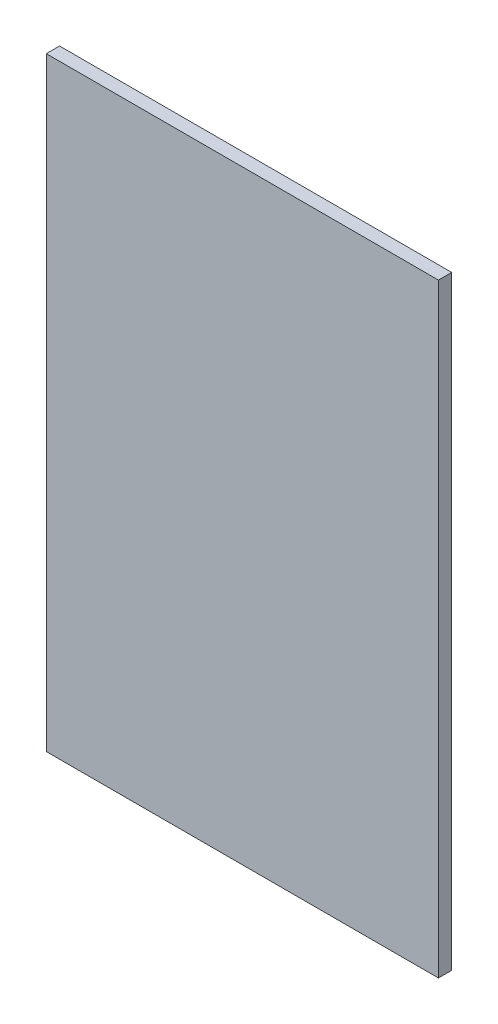
ISO-10303-21;
HEADER;
FILE_DESCRIPTION(('STEP AP214'),'2;1');
FILE_NAME('part.step','',(''),(''),'','','');
FILE_SCHEMA(('AUTOMOTIVE_DESIGN { 1 0 10303 214 1 1 1 1 }'));
ENDSEC;
DATA;
#1=APPLICATION_CONTEXT('core data for automotive mechanical design processes');
#2=APPLICATION_PROTOCOL_DEFINITION('international standard','automotive_design',2000,#1);
#3=PRODUCT_CONTEXT('',#1,'mechanical');
#4=PRODUCT('Part','Part','',(#3));
#5=PRODUCT_RELATED_PRODUCT_CATEGORY('part','',(#4));
#6=PRODUCT_DEFINITION_FORMATION('','',#4);
#7=PRODUCT_DEFINITION_CONTEXT('part definition',#1,'design');
#8=PRODUCT_DEFINITION('design','',#6,#7);
#9=PRODUCT_DEFINITION_SHAPE('','',#8);
#10=(LENGTH_UNIT() NAMED_UNIT(*) SI_UNIT(.MILLI.,.METRE.));
#11=(NAMED_UNIT(*) PLANE_ANGLE_UNIT() SI_UNIT($,.RADIAN.));
#12=(NAMED_UNIT(*) SI_UNIT($,.STERADIAN.) SOLID_ANGLE_UNIT());
#13=UNCERTAINTY_MEASURE_WITH_UNIT(LENGTH_MEASURE(1.E-05),#10,'distance_accuracy_value','');
#14=(GEOMETRIC_REPRESENTATION_CONTEXT(3) GLOBAL_UNCERTAINTY_ASSIGNED_CONTEXT((#13)) GLOBAL_UNIT_ASSIGNED_CONTEXT((#10,
#11,#12)) REPRESENTATION_CONTEXT('',''));
#15=CARTESIAN_POINT('',(0.,0.,0.));
#16=DIRECTION('',(0.,0.,1.));
#17=DIRECTION('',(1.,0.,0.));
#18=AXIS2_PLACEMENT_3D('',#15,#16,#17);
#19=CARTESIAN_POINT('',(266.,410.,18.));
#20=DIRECTION('',(-1.,0.,0.));
#21=DIRECTION('',(0.,-1.,0.));
#22=AXIS2_PLACEMENT_3D('',#19,#20,#21);
#23=PLANE('',#22);
#24=DIRECTION('',(0.,1.,0.));
#25=VECTOR('',#24,1.);
#26=CARTESIAN_POINT('',(266.,410.,0.));
#27=LINE('',#26,#25);
#28=CARTESIAN_POINT('',(266.,-410.,0.));
#29=VERTEX_POINT('',#28);
#30=CARTESIAN_POINT('',(266.,410.,0.));
#31=VERTEX_POINT('',#30);
#32=EDGE_CURVE('E107',#29,#31,#27,.T.);
#33=ORIENTED_EDGE('',*,*,#32,.T.);
#34=DIRECTION('',(0.,0.,-1.));
#35=VECTOR('',#34,1.);
#36=CARTESIAN_POINT('',(266.,410.,18.));
#37=LINE('',#36,#35);
#38=CARTESIAN_POINT('',(266.,410.,18.));
#39=VERTEX_POINT('',#38);
#40=EDGE_CURVE('E11',#39,#31,#37,.T.);
#41=ORIENTED_EDGE('',*,*,#40,.F.);
#42=DIRECTION('',(0.,1.,0.));
#43=VECTOR('',#42,1.);
#44=CARTESIAN_POINT('',(266.,410.,18.));
#45=LINE('',#44,#43);
#46=CARTESIAN_POINT('',(266.,-410.,18.));
#47=VERTEX_POINT('',#46);
#48=EDGE_CURVE('E91',#47,#39,#45,.T.);
#49=ORIENTED_EDGE('',*,*,#48,.F.);
#50=DIRECTION('',(0.,0.,-1.));
#51=VECTOR('',#50,1.);
#52=CARTESIAN_POINT('',(266.,-410.,18.));
#53=LINE('',#52,#51);
#54=EDGE_CURVE('E103',#47,#29,#53,.T.);
#55=ORIENTED_EDGE('',*,*,#54,.T.);
#56=EDGE_LOOP('',(#33,#41,#49,#55));
#57=FACE_BOUND('',#56,.T.);
#58=ADVANCED_FACE('F39',(#57),#23,.F.);
#59=CARTESIAN_POINT('',(-266.,410.,18.));
#60=DIRECTION('',(0.,-1.,0.));
#61=DIRECTION('',(0.,0.,-1.));
#62=AXIS2_PLACEMENT_3D('',#59,#60,#61);
#63=PLANE('',#62);
#64=DIRECTION('',(-1.,0.,0.));
#65=VECTOR('',#64,1.);
#66=CARTESIAN_POINT('',(-266.,410.,0.));
#67=LINE('',#66,#65);
#68=CARTESIAN_POINT('',(-266.,410.,0.));
#69=VERTEX_POINT('',#68);
#70=EDGE_CURVE('E96',#31,#69,#67,.T.);
#71=ORIENTED_EDGE('',*,*,#70,.T.);
#72=DIRECTION('',(0.,0.,-1.));
#73=VECTOR('',#72,1.);
#74=CARTESIAN_POINT('',(-266.,410.,18.));
#75=LINE('',#74,#73);
#76=CARTESIAN_POINT('',(-266.,410.,18.));
#77=VERTEX_POINT('',#76);
#78=EDGE_CURVE('E48',#77,#69,#75,.T.);
#79=ORIENTED_EDGE('',*,*,#78,.F.);
#80=DIRECTION('',(-1.,0.,0.));
#81=VECTOR('',#80,1.);
#82=CARTESIAN_POINT('',(-266.,410.,18.));
#83=LINE('',#82,#81);
#84=EDGE_CURVE('E86',#39,#77,#83,.T.);
#85=ORIENTED_EDGE('',*,*,#84,.F.);
#86=ORIENTED_EDGE('',*,*,#40,.T.);
#87=EDGE_LOOP('',(#71,#79,#85,#86));
#88=FACE_BOUND('',#87,.T.);
#89=ADVANCED_FACE('F95',(#88),#63,.F.);
#90=CARTESIAN_POINT('',(-266.,410.,18.));
#91=DIRECTION('',(1.,0.,0.));
#92=DIRECTION('',(0.,1.,0.));
#93=AXIS2_PLACEMENT_3D('',#90,#91,#92);
#94=PLANE('',#93);
#95=DIRECTION('',(0.,-1.,0.));
#96=VECTOR('',#95,1.);
#97=CARTESIAN_POINT('',(-266.,410.,0.));
#98=LINE('',#97,#96);
#99=CARTESIAN_POINT('',(-266.,-410.,0.));
#100=VERTEX_POINT('',#99);
#101=EDGE_CURVE('E73',#69,#100,#98,.T.);
#102=ORIENTED_EDGE('',*,*,#101,.T.);
#103=DIRECTION('',(0.,0.,-1.));
#104=VECTOR('',#103,1.);
#105=CARTESIAN_POINT('',(-266.,-410.,18.));
#106=LINE('',#105,#104);
#107=CARTESIAN_POINT('',(-266.,-410.,18.));
#108=VERTEX_POINT('',#107);
#109=EDGE_CURVE('E98',#108,#100,#106,.T.);
#110=ORIENTED_EDGE('',*,*,#109,.F.);
#111=DIRECTION('',(0.,-1.,0.));
#112=VECTOR('',#111,1.);
#113=CARTESIAN_POINT('',(-266.,410.,18.));
#114=LINE('',#113,#112);
#115=EDGE_CURVE('E89',#77,#108,#114,.T.);
#116=ORIENTED_EDGE('',*,*,#115,.F.);
#117=ORIENTED_EDGE('',*,*,#78,.T.);
#118=EDGE_LOOP('',(#102,#110,#116,#117));
#119=FACE_BOUND('',#118,.T.);
#120=ADVANCED_FACE('F99',(#119),#94,.F.);
#121=CARTESIAN_POINT('',(-266.,-410.,18.));
#122=DIRECTION('',(0.,1.,0.));
#123=DIRECTION('',(0.,0.,1.));
#124=AXIS2_PLACEMENT_3D('',#121,#122,#123);
#125=PLANE('',#124);
#126=DIRECTION('',(1.,0.,0.));
#127=VECTOR('',#126,1.);
#128=CARTESIAN_POINT('',(-266.,-410.,0.));
#129=LINE('',#128,#127);
#130=EDGE_CURVE('E79',#100,#29,#129,.T.);
#131=ORIENTED_EDGE('',*,*,#130,.T.);
#132=ORIENTED_EDGE('',*,*,#54,.F.);
#133=DIRECTION('',(1.,0.,0.));
#134=VECTOR('',#133,1.);
#135=CARTESIAN_POINT('',(-266.,-410.,18.));
#136=LINE('',#135,#134);
#137=EDGE_CURVE('E56',#108,#47,#136,.T.);
#138=ORIENTED_EDGE('',*,*,#137,.F.);
#139=ORIENTED_EDGE('',*,*,#109,.T.);
#140=EDGE_LOOP('',(#131,#132,#138,#139));
#141=FACE_BOUND('',#140,.T.);
#142=ADVANCED_FACE('F120',(#141),#125,.F.);
#143=CARTESIAN_POINT('',(0.,0.,18.));
#144=DIRECTION('',(0.,0.,1.));
#145=DIRECTION('',(1.,0.,0.));
#146=AXIS2_PLACEMENT_3D('',#143,#144,#145);
#147=PLANE('',#146);
#148=ORIENTED_EDGE('',*,*,#48,.T.);
#149=ORIENTED_EDGE('',*,*,#84,.T.);
#150=ORIENTED_EDGE('',*,*,#115,.T.);
#151=ORIENTED_EDGE('',*,*,#137,.T.);
#152=EDGE_LOOP('',(#148,#149,#150,#151));
#153=FACE_BOUND('',#152,.T.);
#154=ADVANCED_FACE('F87',(#153),#147,.T.);
#155=CARTESIAN_POINT('',(0.,0.,0.));
#156=DIRECTION('',(0.,0.,1.));
#157=DIRECTION('',(1.,0.,0.));
#158=AXIS2_PLACEMENT_3D('',#155,#156,#157);
#159=PLANE('',#158);
#160=ORIENTED_EDGE('',*,*,#32,.F.);
#161=ORIENTED_EDGE('',*,*,#130,.F.);
#162=ORIENTED_EDGE('',*,*,#101,.F.);
#163=ORIENTED_EDGE('',*,*,#70,.F.);
#164=EDGE_LOOP('',(#160,#161,#162,#163));
#165=FACE_BOUND('',#164,.T.);
#166=ADVANCED_FACE('F123',(#165),#159,.F.);
#167=CLOSED_SHELL('',(#58,#89,#120,#142,#154,#166));
#168=MANIFOLD_SOLID_BREP('B2',#167);
#169=ADVANCED_BREP_SHAPE_REPRESENTATION('',(#18,#168),#14);
#170=SHAPE_DEFINITION_REPRESENTATION(#9,#169);
ENDSEC;
END-ISO-10303-21;
